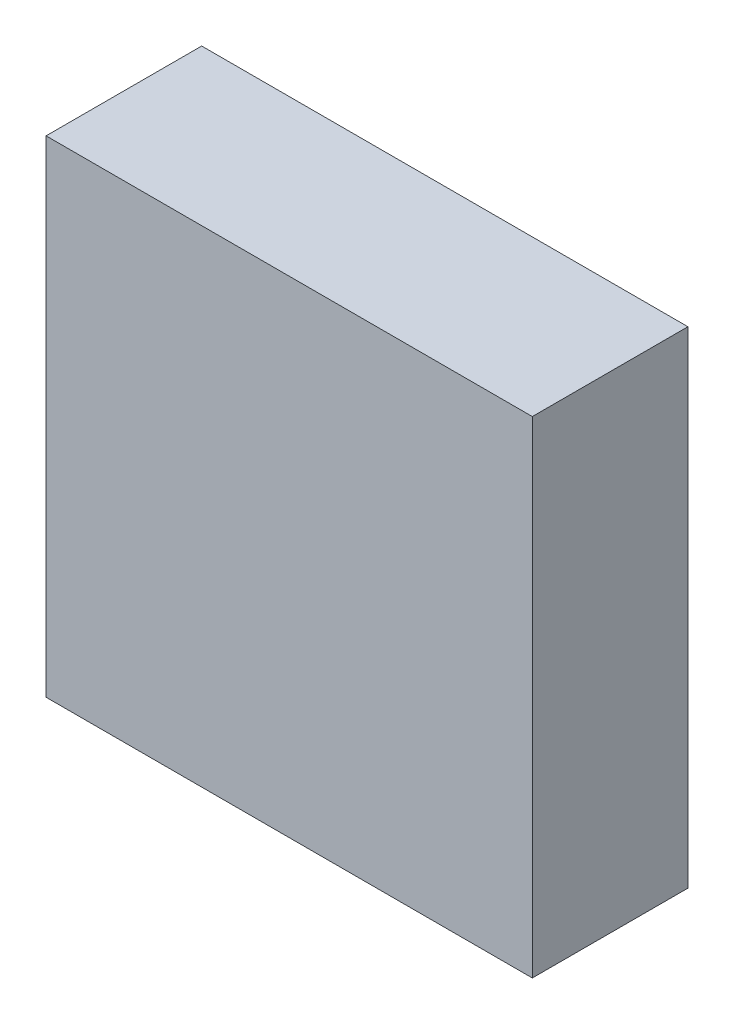
ISO-10303-21;
HEADER;
FILE_DESCRIPTION(('STEP AP214'),'2;1');
FILE_NAME('part.step','',(''),(''),'','','');
FILE_SCHEMA(('AUTOMOTIVE_DESIGN { 1 0 10303 214 1 1 1 1 }'));
ENDSEC;
DATA;
#1=APPLICATION_CONTEXT('core data for automotive mechanical design processes');
#2=APPLICATION_PROTOCOL_DEFINITION('international standard','automotive_design',2000,#1);
#3=PRODUCT_CONTEXT('',#1,'mechanical');
#4=PRODUCT('Part','Part','',(#3));
#5=PRODUCT_RELATED_PRODUCT_CATEGORY('part','',(#4));
#6=PRODUCT_DEFINITION_FORMATION('','',#4);
#7=PRODUCT_DEFINITION_CONTEXT('part definition',#1,'design');
#8=PRODUCT_DEFINITION('design','',#6,#7);
#9=PRODUCT_DEFINITION_SHAPE('','',#8);
#10=(LENGTH_UNIT() NAMED_UNIT(*) SI_UNIT(.MILLI.,.METRE.));
#11=(NAMED_UNIT(*) PLANE_ANGLE_UNIT() SI_UNIT($,.RADIAN.));
#12=(NAMED_UNIT(*) SI_UNIT($,.STERADIAN.) SOLID_ANGLE_UNIT());
#13=UNCERTAINTY_MEASURE_WITH_UNIT(LENGTH_MEASURE(1.E-05),#10,'distance_accuracy_value','');
#14=(GEOMETRIC_REPRESENTATION_CONTEXT(3) GLOBAL_UNCERTAINTY_ASSIGNED_CONTEXT((#13)) GLOBAL_UNIT_ASSIGNED_CONTEXT((#10,
#11,#12)) REPRESENTATION_CONTEXT('',''));
#15=CARTESIAN_POINT('',(0.,0.,0.));
#16=DIRECTION('',(0.,0.,1.));
#17=DIRECTION('',(1.,0.,0.));
#18=AXIS2_PLACEMENT_3D('',#15,#16,#17);
#19=CARTESIAN_POINT('',(2.50000008,-2.49999754,1.59999934));
#20=DIRECTION('',(0.,0.,1.));
#21=DIRECTION('',(1.,0.,0.));
#22=AXIS2_PLACEMENT_3D('',#19,#20,#21);
#23=PLANE('',#22);
#24=DIRECTION('',(5.08000242628534E-07,-0.999999999999871,0.));
#25=VECTOR('',#24,1.);
#26=CARTESIAN_POINT('',(-2.49999754,-2.50000008,1.59999934));
#27=LINE('',#26,#25);
#28=CARTESIAN_POINT('',(-2.49999881,-2.50000008,1.59999934));
#29=VERTEX_POINT('',#28);
#30=CARTESIAN_POINT('',(-2.50000008,2.49999881,1.59999934));
#31=VERTEX_POINT('',#30);
#32=EDGE_CURVE('E53',#29,#31,#27,.F.);
#33=ORIENTED_EDGE('',*,*,#32,.F.);
#34=DIRECTION('',(0.999999999999871,5.08000242628534E-07,0.));
#35=VECTOR('',#34,1.);
#36=CARTESIAN_POINT('',(2.50000008,-2.49999754,1.59999934));
#37=LINE('',#36,#35);
#38=CARTESIAN_POINT('',(2.50000008,-2.499998175,1.59999934));
#39=VERTEX_POINT('',#38);
#40=EDGE_CURVE('E68',#39,#29,#37,.F.);
#41=ORIENTED_EDGE('',*,*,#40,.F.);
#42=DIRECTION('',(-5.08000241207434E-07,0.999999999999871,0.));
#43=VECTOR('',#42,1.);
#44=CARTESIAN_POINT('',(2.49999754,2.50000008,1.59999934));
#45=LINE('',#44,#43);
#46=CARTESIAN_POINT('',(2.49999881,2.50000008,1.59999934));
#47=VERTEX_POINT('',#46);
#48=EDGE_CURVE('E20',#47,#39,#45,.F.);
#49=ORIENTED_EDGE('',*,*,#48,.F.);
#50=DIRECTION('',(-0.999999999999871,-5.08000242628534E-07,0.));
#51=VECTOR('',#50,1.);
#52=CARTESIAN_POINT('',(-2.50000008,2.49999754,1.59999934));
#53=LINE('',#52,#51);
#54=EDGE_CURVE('E58',#31,#47,#53,.F.);
#55=ORIENTED_EDGE('',*,*,#54,.F.);
#56=EDGE_LOOP('',(#33,#41,#49,#55));
#57=FACE_BOUND('',#56,.T.);
#58=ADVANCED_FACE('F17',(#57),#23,.T.);
#59=CARTESIAN_POINT('',(2.49999754,2.50000008,0.));
#60=DIRECTION('',(0.999999999999871,5.08000241207434E-07,0.));
#61=DIRECTION('',(-5.08000241207434E-07,0.999999999999871,0.));
#62=AXIS2_PLACEMENT_3D('',#59,#60,#61);
#63=PLANE('',#62);
#64=DIRECTION('',(0.,0.,1.));
#65=VECTOR('',#64,1.);
#66=CARTESIAN_POINT('',(2.50000008,-2.49999754,0.));
#67=LINE('',#66,#65);
#68=CARTESIAN_POINT('',(2.50000008,-2.499998175,0.));
#69=VERTEX_POINT('',#68);
#70=EDGE_CURVE('E79',#69,#39,#67,.T.);
#71=ORIENTED_EDGE('',*,*,#70,.F.);
#72=DIRECTION('',(0.,1.,0.));
#73=VECTOR('',#72,1.);
#74=CARTESIAN_POINT('',(2.50000008,-2.49999754,0.));
#75=LINE('',#74,#73);
#76=CARTESIAN_POINT('',(2.499998175,2.50000008,0.));
#77=VERTEX_POINT('',#76);
#78=EDGE_CURVE('E74',#69,#77,#75,.T.);
#79=ORIENTED_EDGE('',*,*,#78,.T.);
#80=DIRECTION('',(0.,0.,1.));
#81=VECTOR('',#80,1.);
#82=CARTESIAN_POINT('',(2.49999754,2.50000008000001,0.));
#83=LINE('',#82,#81);
#84=EDGE_CURVE('E63',#47,#77,#83,.F.);
#85=ORIENTED_EDGE('',*,*,#84,.F.);
#86=ORIENTED_EDGE('',*,*,#48,.T.);
#87=EDGE_LOOP('',(#71,#79,#85,#86));
#88=FACE_BOUND('',#87,.T.);
#89=ADVANCED_FACE('F73',(#88),#63,.T.);
#90=CARTESIAN_POINT('',(-2.50000008,2.49999754,0.));
#91=DIRECTION('',(-5.08000242628534E-07,0.999999999999871,0.));
#92=DIRECTION('',(-0.999999999999871,-5.08000242628534E-07,0.));
#93=AXIS2_PLACEMENT_3D('',#90,#91,#92);
#94=PLANE('',#93);
#95=ORIENTED_EDGE('',*,*,#84,.T.);
#96=DIRECTION('',(1.,0.,0.));
#97=VECTOR('',#96,1.);
#98=CARTESIAN_POINT('',(2.50000008,2.50000008,0.));
#99=LINE('',#98,#97);
#100=CARTESIAN_POINT('',(-2.50000008,2.499998175,0.));
#101=VERTEX_POINT('',#100);
#102=EDGE_CURVE('E84',#77,#101,#99,.F.);
#103=ORIENTED_EDGE('',*,*,#102,.T.);
#104=DIRECTION('',(0.,0.,1.));
#105=VECTOR('',#104,1.);
#106=CARTESIAN_POINT('',(-2.50000008000001,2.49999754,0.));
#107=LINE('',#106,#105);
#108=EDGE_CURVE('E65',#31,#101,#107,.F.);
#109=ORIENTED_EDGE('',*,*,#108,.F.);
#110=ORIENTED_EDGE('',*,*,#54,.T.);
#111=EDGE_LOOP('',(#95,#103,#109,#110));
#112=FACE_BOUND('',#111,.T.);
#113=ADVANCED_FACE('F60',(#112),#94,.T.);
#114=CARTESIAN_POINT('',(-2.49999754,-2.50000008,0.));
#115=DIRECTION('',(-0.999999999999871,-5.08000242628534E-07,0.));
#116=DIRECTION('',(5.08000242628534E-07,-0.999999999999871,0.));
#117=AXIS2_PLACEMENT_3D('',#114,#115,#116);
#118=PLANE('',#117);
#119=ORIENTED_EDGE('',*,*,#108,.T.);
#120=DIRECTION('',(0.,1.,0.));
#121=VECTOR('',#120,1.);
#122=CARTESIAN_POINT('',(-2.50000008,-2.49999754,0.));
#123=LINE('',#122,#121);
#124=CARTESIAN_POINT('',(-2.499998175,-2.50000008,0.));
#125=VERTEX_POINT('',#124);
#126=EDGE_CURVE('E26',#101,#125,#123,.F.);
#127=ORIENTED_EDGE('',*,*,#126,.T.);
#128=DIRECTION('',(0.,0.,1.));
#129=VECTOR('',#128,1.);
#130=CARTESIAN_POINT('',(-2.49999754,-2.50000008000001,0.));
#131=LINE('',#130,#129);
#132=EDGE_CURVE('E34',#29,#125,#131,.F.);
#133=ORIENTED_EDGE('',*,*,#132,.F.);
#134=ORIENTED_EDGE('',*,*,#32,.T.);
#135=EDGE_LOOP('',(#119,#127,#133,#134));
#136=FACE_BOUND('',#135,.T.);
#137=ADVANCED_FACE('F88',(#136),#118,.T.);
#138=CARTESIAN_POINT('',(2.50000008,-2.49999754,0.));
#139=DIRECTION('',(5.08000242628534E-07,-0.999999999999871,0.));
#140=DIRECTION('',(0.999999999999871,5.08000242628534E-07,0.));
#141=AXIS2_PLACEMENT_3D('',#138,#139,#140);
#142=PLANE('',#141);
#143=ORIENTED_EDGE('',*,*,#132,.T.);
#144=DIRECTION('',(1.,0.,0.));
#145=VECTOR('',#144,1.);
#146=CARTESIAN_POINT('',(2.50000008,-2.50000008,0.));
#147=LINE('',#146,#145);
#148=EDGE_CURVE('E11',#125,#69,#147,.T.);
#149=ORIENTED_EDGE('',*,*,#148,.T.);
#150=ORIENTED_EDGE('',*,*,#70,.T.);
#151=ORIENTED_EDGE('',*,*,#40,.T.);
#152=EDGE_LOOP('',(#143,#149,#150,#151));
#153=FACE_BOUND('',#152,.T.);
#154=ADVANCED_FACE('F91',(#153),#142,.T.);
#155=CARTESIAN_POINT('',(2.50000008,-2.49999754,0.));
#156=DIRECTION('',(0.,0.,1.));
#157=DIRECTION('',(1.,0.,0.));
#158=AXIS2_PLACEMENT_3D('',#155,#156,#157);
#159=PLANE('',#158);
#160=ORIENTED_EDGE('',*,*,#126,.F.);
#161=ORIENTED_EDGE('',*,*,#102,.F.);
#162=ORIENTED_EDGE('',*,*,#78,.F.);
#163=ORIENTED_EDGE('',*,*,#148,.F.);
#164=EDGE_LOOP('',(#160,#161,#162,#163));
#165=FACE_BOUND('',#164,.T.);
#166=ADVANCED_FACE('F90',(#165),#159,.F.);
#167=CLOSED_SHELL('',(#58,#89,#113,#137,#154,#166));
#168=MANIFOLD_SOLID_BREP('B1',#167);
#169=ADVANCED_BREP_SHAPE_REPRESENTATION('',(#18,#168),#14);
#170=SHAPE_DEFINITION_REPRESENTATION(#9,#169);
ENDSEC;
END-ISO-10303-21;
